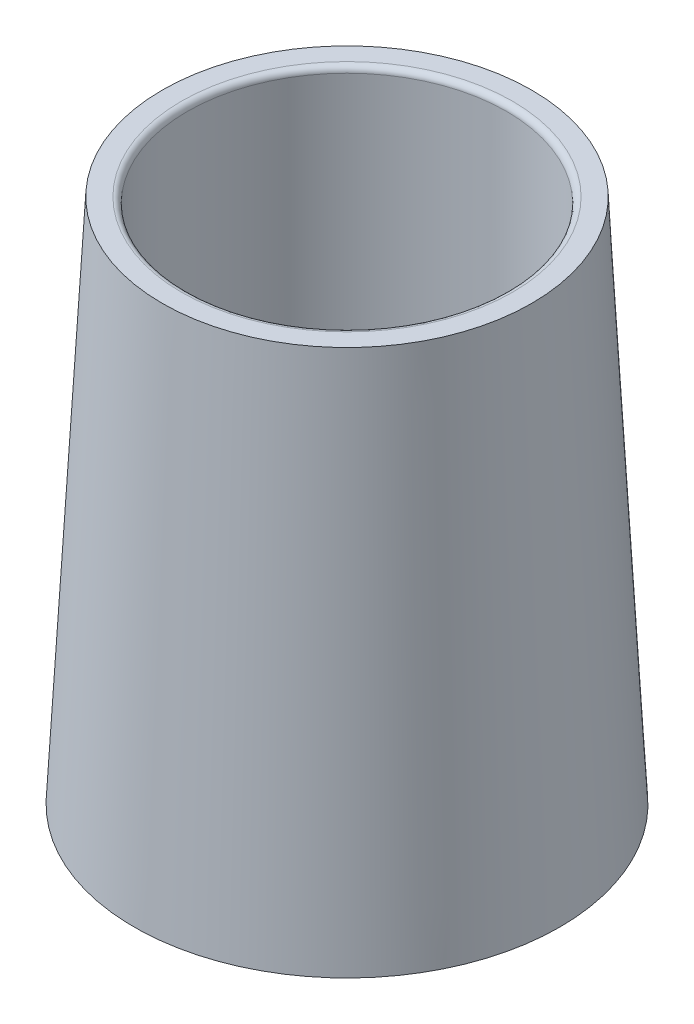
ISO-10303-21;
HEADER;
FILE_DESCRIPTION(('STEP AP214'),'2;1');
FILE_NAME('part.step','',(''),(''),'','','');
FILE_SCHEMA(('AUTOMOTIVE_DESIGN { 1 0 10303 214 1 1 1 1 }'));
ENDSEC;
DATA;
#1=APPLICATION_CONTEXT('core data for automotive mechanical design processes');
#2=APPLICATION_PROTOCOL_DEFINITION('international standard','automotive_design',2000,#1);
#3=PRODUCT_CONTEXT('',#1,'mechanical');
#4=PRODUCT('Part','Part','',(#3));
#5=PRODUCT_RELATED_PRODUCT_CATEGORY('part','',(#4));
#6=PRODUCT_DEFINITION_FORMATION('','',#4);
#7=PRODUCT_DEFINITION_CONTEXT('part definition',#1,'design');
#8=PRODUCT_DEFINITION('design','',#6,#7);
#9=PRODUCT_DEFINITION_SHAPE('','',#8);
#10=(LENGTH_UNIT() NAMED_UNIT(*) SI_UNIT(.MILLI.,.METRE.));
#11=(NAMED_UNIT(*) PLANE_ANGLE_UNIT() SI_UNIT($,.RADIAN.));
#12=(NAMED_UNIT(*) SI_UNIT($,.STERADIAN.) SOLID_ANGLE_UNIT());
#13=UNCERTAINTY_MEASURE_WITH_UNIT(LENGTH_MEASURE(1.E-05),#10,'distance_accuracy_value','');
#14=(GEOMETRIC_REPRESENTATION_CONTEXT(3) GLOBAL_UNCERTAINTY_ASSIGNED_CONTEXT((#13)) GLOBAL_UNIT_ASSIGNED_CONTEXT((#10,
#11,#12)) REPRESENTATION_CONTEXT('',''));
#15=CARTESIAN_POINT('',(0.,0.,0.));
#16=DIRECTION('',(0.,0.,1.));
#17=DIRECTION('',(1.,0.,0.));
#18=AXIS2_PLACEMENT_3D('',#15,#16,#17);
#19=CARTESIAN_POINT('',(0.,0.,0.));
#20=DIRECTION('',(0.,1.,0.));
#21=DIRECTION('',(-1.,0.,0.));
#22=AXIS2_PLACEMENT_3D('',#19,#20,#21);
#23=PLANE('',#22);
#24=CARTESIAN_POINT('',(0.,0.,0.));
#25=DIRECTION('',(0.,-1.,0.));
#26=DIRECTION('',(1.,0.,0.));
#27=AXIS2_PLACEMENT_3D('',#24,#25,#26);
#28=CIRCLE('',#27,28.9);
#29=CARTESIAN_POINT('',(28.9,0.,0.));
#30=VERTEX_POINT('',#29);
#31=EDGE_CURVE('E67',#30,#30,#28,.T.);
#32=ORIENTED_EDGE('',*,*,#31,.F.);
#33=EDGE_LOOP('',(#32));
#34=FACE_BOUND('',#33,.T.);
#35=CARTESIAN_POINT('',(0.,0.,0.));
#36=DIRECTION('',(0.,1.,0.));
#37=DIRECTION('',(-1.,0.,0.));
#38=AXIS2_PLACEMENT_3D('',#35,#36,#37);
#39=CIRCLE('',#38,36.);
#40=CARTESIAN_POINT('',(-36.,0.,0.));
#41=VERTEX_POINT('',#40);
#42=EDGE_CURVE('E57',#41,#41,#39,.T.);
#43=ORIENTED_EDGE('',*,*,#42,.F.);
#44=EDGE_LOOP('',(#43));
#45=FACE_BOUND('',#44,.T.);
#46=ADVANCED_FACE('F31',(#34,#45),#23,.F.);
#47=CARTESIAN_POINT('',(0.,0.,0.));
#48=DIRECTION('',(0.,-1.,0.));
#49=DIRECTION('',(1.,0.,0.));
#50=AXIS2_PLACEMENT_3D('',#47,#48,#49);
#51=CONICAL_SURFACE('',#50,36.,0.0533201984374761);
#52=CARTESIAN_POINT('',(0.,89.,0.));
#53=DIRECTION('',(0.,1.,0.));
#54=DIRECTION('',(-1.,0.,0.));
#55=AXIS2_PLACEMENT_3D('',#52,#53,#54);
#56=CIRCLE('',#55,31.25);
#57=CARTESIAN_POINT('',(-31.25,89.,0.));
#58=VERTEX_POINT('',#57);
#59=EDGE_CURVE('E60',#58,#58,#56,.T.);
#60=ORIENTED_EDGE('',*,*,#59,.F.);
#61=EDGE_LOOP('',(#60));
#62=FACE_BOUND('',#61,.T.);
#63=ORIENTED_EDGE('',*,*,#42,.T.);
#64=EDGE_LOOP('',(#63));
#65=FACE_BOUND('',#64,.T.);
#66=ADVANCED_FACE('F84',(#62,#65),#51,.T.);
#67=CARTESIAN_POINT('',(31.25,89.,0.));
#68=DIRECTION('',(0.,-1.,0.));
#69=DIRECTION('',(1.,0.,0.));
#70=AXIS2_PLACEMENT_3D('',#67,#68,#69);
#71=PLANE('',#70);
#72=CARTESIAN_POINT('',(0.,89.,0.));
#73=DIRECTION('',(0.,-1.,0.));
#74=DIRECTION('',(1.,0.,0.));
#75=AXIS2_PLACEMENT_3D('',#72,#73,#74);
#76=CIRCLE('',#75,28.);
#77=CARTESIAN_POINT('',(28.,89.,0.));
#78=VERTEX_POINT('',#77);
#79=EDGE_CURVE('E51',#78,#78,#76,.T.);
#80=ORIENTED_EDGE('',*,*,#79,.T.);
#81=EDGE_LOOP('',(#80));
#82=FACE_BOUND('',#81,.T.);
#83=ORIENTED_EDGE('',*,*,#59,.T.);
#84=EDGE_LOOP('',(#83));
#85=FACE_BOUND('',#84,.T.);
#86=ADVANCED_FACE('F89',(#82,#85),#71,.F.);
#87=CARTESIAN_POINT('',(0.,32.,0.));
#88=DIRECTION('',(0.,1.,0.));
#89=DIRECTION('',(-1.,0.,0.));
#90=AXIS2_PLACEMENT_3D('',#87,#88,#89);
#91=CYLINDRICAL_SURFACE('',#90,27.);
#92=CARTESIAN_POINT('',(0.,88.,0.));
#93=DIRECTION('',(0.,-1.,0.));
#94=DIRECTION('',(1.,0.,0.));
#95=AXIS2_PLACEMENT_3D('',#92,#93,#94);
#96=CIRCLE('',#95,27.);
#97=CARTESIAN_POINT('',(-27.,88.,0.));
#98=VERTEX_POINT('',#97);
#99=EDGE_CURVE('E54',#98,#98,#96,.F.);
#100=CARTESIAN_POINT('',(0.,32.,0.));
#101=DIRECTION('',(0.,1.,0.));
#102=DIRECTION('',(-1.,0.,0.));
#103=AXIS2_PLACEMENT_3D('',#100,#101,#102);
#104=CIRCLE('',#103,27.);
#105=CARTESIAN_POINT('',(-27.,32.,0.));
#106=VERTEX_POINT('',#105);
#107=EDGE_CURVE('E63',#106,#106,#104,.T.);
#108=CARTESIAN_POINT('',(-27.,88.,0.));
#109=CARTESIAN_POINT('',(-27.,87.4166666666667,0.));
#110=CARTESIAN_POINT('',(-27.,86.8333333333333,0.));
#111=CARTESIAN_POINT('',(-27.,85.6666666666667,0.));
#112=CARTESIAN_POINT('',(-27.,85.0833333333333,0.));
#113=CARTESIAN_POINT('',(-27.,83.9166666666667,0.));
#114=CARTESIAN_POINT('',(-27.,83.3333333333333,0.));
#115=CARTESIAN_POINT('',(-27.,82.1666666666667,0.));
#116=CARTESIAN_POINT('',(-27.,81.5833333333333,0.));
#117=CARTESIAN_POINT('',(-27.,80.4166666666667,0.));
#118=CARTESIAN_POINT('',(-27.,79.8333333333333,0.));
#119=CARTESIAN_POINT('',(-27.,78.6666666666667,0.));
#120=CARTESIAN_POINT('',(-27.,78.0833333333333,0.));
#121=CARTESIAN_POINT('',(-27.,76.9166666666667,0.));
#122=CARTESIAN_POINT('',(-27.,76.3333333333333,0.));
#123=CARTESIAN_POINT('',(-27.,75.1666666666667,0.));
#124=CARTESIAN_POINT('',(-27.,74.5833333333333,0.));
#125=CARTESIAN_POINT('',(-27.,73.4166666666667,0.));
#126=CARTESIAN_POINT('',(-27.,72.8333333333333,0.));
#127=CARTESIAN_POINT('',(-27.,71.6666666666667,0.));
#128=CARTESIAN_POINT('',(-27.,71.0833333333333,0.));
#129=CARTESIAN_POINT('',(-27.,69.9166666666667,0.));
#130=CARTESIAN_POINT('',(-27.,69.3333333333333,0.));
#131=CARTESIAN_POINT('',(-27.,68.1666666666667,0.));
#132=CARTESIAN_POINT('',(-27.,67.5833333333333,0.));
#133=CARTESIAN_POINT('',(-27.,66.4166666666667,0.));
#134=CARTESIAN_POINT('',(-27.,65.8333333333333,0.));
#135=CARTESIAN_POINT('',(-27.,64.6666666666667,0.));
#136=CARTESIAN_POINT('',(-27.,64.0833333333333,0.));
#137=CARTESIAN_POINT('',(-27.,62.9166666666667,0.));
#138=CARTESIAN_POINT('',(-27.,62.3333333333333,0.));
#139=CARTESIAN_POINT('',(-27.,61.1666666666667,0.));
#140=CARTESIAN_POINT('',(-27.,60.5833333333333,0.));
#141=CARTESIAN_POINT('',(-27.,59.4166666666667,0.));
#142=CARTESIAN_POINT('',(-27.,58.8333333333333,0.));
#143=CARTESIAN_POINT('',(-27.,57.6666666666667,0.));
#144=CARTESIAN_POINT('',(-27.,57.0833333333333,0.));
#145=CARTESIAN_POINT('',(-27.,55.9166666666667,0.));
#146=CARTESIAN_POINT('',(-27.,55.3333333333333,0.));
#147=CARTESIAN_POINT('',(-27.,54.1666666666667,0.));
#148=CARTESIAN_POINT('',(-27.,53.5833333333333,0.));
#149=CARTESIAN_POINT('',(-27.,52.4166666666667,0.));
#150=CARTESIAN_POINT('',(-27.,51.8333333333333,0.));
#151=CARTESIAN_POINT('',(-27.,50.6666666666667,0.));
#152=CARTESIAN_POINT('',(-27.,50.0833333333333,0.));
#153=CARTESIAN_POINT('',(-27.,48.9166666666667,0.));
#154=CARTESIAN_POINT('',(-27.,48.3333333333333,0.));
#155=CARTESIAN_POINT('',(-27.,47.1666666666667,0.));
#156=CARTESIAN_POINT('',(-27.,46.5833333333333,0.));
#157=CARTESIAN_POINT('',(-27.,45.4166666666667,0.));
#158=CARTESIAN_POINT('',(-27.,44.8333333333333,0.));
#159=CARTESIAN_POINT('',(-27.,43.6666666666667,0.));
#160=CARTESIAN_POINT('',(-27.,43.0833333333333,0.));
#161=CARTESIAN_POINT('',(-27.,41.9166666666667,0.));
#162=CARTESIAN_POINT('',(-27.,41.3333333333333,0.));
#163=CARTESIAN_POINT('',(-27.,40.1666666666667,0.));
#164=CARTESIAN_POINT('',(-27.,39.5833333333333,0.));
#165=CARTESIAN_POINT('',(-27.,38.4166666666667,0.));
#166=CARTESIAN_POINT('',(-27.,37.8333333333333,0.));
#167=CARTESIAN_POINT('',(-27.,36.6666666666667,0.));
#168=CARTESIAN_POINT('',(-27.,36.0833333333333,0.));
#169=CARTESIAN_POINT('',(-27.,34.9166666666667,0.));
#170=CARTESIAN_POINT('',(-27.,34.3333333333333,0.));
#171=CARTESIAN_POINT('',(-27.,33.1666666666667,0.));
#172=CARTESIAN_POINT('',(-27.,32.5833333333333,0.));
#173=CARTESIAN_POINT('',(-27.,32.,0.));
#174=B_SPLINE_CURVE_WITH_KNOTS('',3,(#108,#109,#110,#111,#112,#113,#114,#115,#116,#117,#118,
#119,#120,#121,#122,#123,#124,#125,#126,#127,#128,#129,#130,#131,#132,#133,#134,#135,#136,#137,
#138,#139,#140,#141,#142,#143,#144,#145,#146,#147,#148,#149,#150,#151,#152,#153,#154,#155,#156,
#157,#158,#159,#160,#161,#162,#163,#164,#165,#166,#167,#168,#169,#170,#171,#172,#173),
.UNSPECIFIED.,.F.,.F.,(4,2,2,2,2,2,2,2,2,2,2,2,2,2,2,2,2,2,2,2,2,2,2,2,2,2,2,2,2,2,2,2,4),(0.,
1.75,3.5,5.25,6.99999999999999,8.74999999999999,10.5,12.25,14.,15.75,17.5,19.25,21.,22.75,24.5,
26.25,28.,29.75,31.5,33.25,35.,36.75,38.5,40.25,42.,43.75,45.5,47.25,49.,50.75,52.5,54.25,56.),.UNSPECIFIED.);
#175=EDGE_CURVE('BSEAM95',#98,#106,#174,.T.);
#176=ORIENTED_EDGE('',*,*,#99,.T.);
#177=ORIENTED_EDGE('',*,*,#107,.F.);
#178=ORIENTED_EDGE('',*,*,#175,.T.);
#179=ORIENTED_EDGE('',*,*,#175,.F.);
#180=EDGE_LOOP('',(#176,#178,#177,#179));
#181=FACE_BOUND('',#180,.T.);
#182=ADVANCED_FACE('F95',(#181),#91,.F.);
#183=CARTESIAN_POINT('',(0.,32.,0.));
#184=DIRECTION('',(0.,1.,0.));
#185=DIRECTION('',(-1.,0.,0.));
#186=AXIS2_PLACEMENT_3D('',#183,#184,#185);
#187=PLANE('',#186);
#188=CARTESIAN_POINT('',(0.,32.,0.));
#189=DIRECTION('',(0.,1.,0.));
#190=DIRECTION('',(-1.,0.,0.));
#191=AXIS2_PLACEMENT_3D('',#188,#189,#190);
#192=CIRCLE('',#191,24.);
#193=CARTESIAN_POINT('',(-24.,32.,0.));
#194=VERTEX_POINT('',#193);
#195=EDGE_CURVE('E38',#194,#194,#192,.F.);
#196=ORIENTED_EDGE('',*,*,#195,.T.);
#197=EDGE_LOOP('',(#196));
#198=FACE_BOUND('',#197,.T.);
#199=ORIENTED_EDGE('',*,*,#107,.T.);
#200=EDGE_LOOP('',(#199));
#201=FACE_BOUND('',#200,.T.);
#202=ADVANCED_FACE('F78',(#198,#201),#187,.T.);
#203=CARTESIAN_POINT('',(0.,11.,0.));
#204=DIRECTION('',(0.,-1.,0.));
#205=DIRECTION('',(1.,0.,0.));
#206=AXIS2_PLACEMENT_3D('',#203,#204,#205);
#207=CYLINDRICAL_SURFACE('',#206,28.9);
#208=CARTESIAN_POINT('',(0.,11.,0.));
#209=DIRECTION('',(0.,-1.,0.));
#210=DIRECTION('',(1.,0.,0.));
#211=AXIS2_PLACEMENT_3D('',#208,#209,#210);
#212=CIRCLE('',#211,28.9);
#213=CARTESIAN_POINT('',(28.9,11.,0.));
#214=VERTEX_POINT('',#213);
#215=EDGE_CURVE('E66',#214,#214,#212,.T.);
#216=ORIENTED_EDGE('',*,*,#215,.F.);
#217=EDGE_LOOP('',(#216));
#218=FACE_BOUND('',#217,.T.);
#219=ORIENTED_EDGE('',*,*,#31,.T.);
#220=EDGE_LOOP('',(#219));
#221=FACE_BOUND('',#220,.T.);
#222=ADVANCED_FACE('F75',(#218,#221),#207,.F.);
#223=CARTESIAN_POINT('',(0.,11.,0.));
#224=DIRECTION('',(0.,-1.,0.));
#225=DIRECTION('',(1.,0.,0.));
#226=AXIS2_PLACEMENT_3D('',#223,#224,#225);
#227=PLANE('',#226);
#228=CARTESIAN_POINT('',(0.,11.,0.));
#229=DIRECTION('',(0.,-1.,0.));
#230=DIRECTION('',(1.,0.,0.));
#231=AXIS2_PLACEMENT_3D('',#228,#229,#230);
#232=CIRCLE('',#231,24.);
#233=CARTESIAN_POINT('',(24.,11.,0.));
#234=VERTEX_POINT('',#233);
#235=EDGE_CURVE('E10',#234,#234,#232,.F.);
#236=ORIENTED_EDGE('',*,*,#235,.T.);
#237=EDGE_LOOP('',(#236));
#238=FACE_BOUND('',#237,.T.);
#239=ORIENTED_EDGE('',*,*,#215,.T.);
#240=EDGE_LOOP('',(#239));
#241=FACE_BOUND('',#240,.T.);
#242=ADVANCED_FACE('F73',(#238,#241),#227,.T.);
#243=CARTESIAN_POINT('',(0.,89.,0.));
#244=DIRECTION('',(0.,-1.,0.));
#245=DIRECTION('',(1.,0.,0.));
#246=AXIS2_PLACEMENT_3D('',#243,#244,#245);
#247=CYLINDRICAL_SURFACE('',#246,23.);
#248=CARTESIAN_POINT('',(0.,31.,0.));
#249=DIRECTION('',(0.,1.,0.));
#250=DIRECTION('',(-1.,0.,0.));
#251=AXIS2_PLACEMENT_3D('',#248,#249,#250);
#252=CIRCLE('',#251,23.);
#253=CARTESIAN_POINT('',(-23.,31.,0.));
#254=VERTEX_POINT('',#253);
#255=EDGE_CURVE('E42',#254,#254,#252,.T.);
#256=ORIENTED_EDGE('',*,*,#255,.T.);
#257=EDGE_LOOP('',(#256));
#258=FACE_BOUND('',#257,.T.);
#259=CARTESIAN_POINT('',(0.,12.,0.));
#260=DIRECTION('',(0.,-1.,0.));
#261=DIRECTION('',(1.,0.,0.));
#262=AXIS2_PLACEMENT_3D('',#259,#260,#261);
#263=CIRCLE('',#262,23.);
#264=CARTESIAN_POINT('',(23.,12.,0.));
#265=VERTEX_POINT('',#264);
#266=EDGE_CURVE('E46',#265,#265,#263,.T.);
#267=ORIENTED_EDGE('',*,*,#266,.T.);
#268=EDGE_LOOP('',(#267));
#269=FACE_BOUND('',#268,.T.);
#270=ADVANCED_FACE('F104',(#258,#269),#247,.F.);
#271=CARTESIAN_POINT('',(0.,88.,0.));
#272=DIRECTION('',(0.,-1.,0.));
#273=DIRECTION('',(1.,0.,0.));
#274=AXIS2_PLACEMENT_3D('',#271,#272,#273);
#275=TOROIDAL_SURFACE('',#274,28.,1.);
#276=ORIENTED_EDGE('',*,*,#79,.F.);
#277=EDGE_LOOP('',(#276));
#278=FACE_BOUND('',#277,.T.);
#279=ORIENTED_EDGE('',*,*,#99,.F.);
#280=EDGE_LOOP('',(#279));
#281=FACE_BOUND('',#280,.T.);
#282=ADVANCED_FACE('F101',(#278,#281),#275,.T.);
#283=CARTESIAN_POINT('',(0.,31.,0.));
#284=DIRECTION('',(0.,1.,0.));
#285=DIRECTION('',(-1.,0.,0.));
#286=AXIS2_PLACEMENT_3D('',#283,#284,#285);
#287=TOROIDAL_SURFACE('',#286,24.,1.);
#288=ORIENTED_EDGE('',*,*,#195,.F.);
#289=EDGE_LOOP('',(#288));
#290=FACE_BOUND('',#289,.T.);
#291=ORIENTED_EDGE('',*,*,#255,.F.);
#292=EDGE_LOOP('',(#291));
#293=FACE_BOUND('',#292,.T.);
#294=ADVANCED_FACE('F103',(#290,#293),#287,.T.);
#295=CARTESIAN_POINT('',(0.,12.,0.));
#296=DIRECTION('',(0.,-1.,0.));
#297=DIRECTION('',(1.,0.,0.));
#298=AXIS2_PLACEMENT_3D('',#295,#296,#297);
#299=TOROIDAL_SURFACE('',#298,24.,1.);
#300=ORIENTED_EDGE('',*,*,#235,.F.);
#301=EDGE_LOOP('',(#300));
#302=FACE_BOUND('',#301,.T.);
#303=ORIENTED_EDGE('',*,*,#266,.F.);
#304=EDGE_LOOP('',(#303));
#305=FACE_BOUND('',#304,.T.);
#306=ADVANCED_FACE('F33',(#302,#305),#299,.T.);
#307=CLOSED_SHELL('',(#46,#66,#86,#182,#202,#222,#242,#270,#282,#294,#306));
#308=MANIFOLD_SOLID_BREP('B2',#307);
#309=ADVANCED_BREP_SHAPE_REPRESENTATION('',(#18,#308),#14);
#310=SHAPE_DEFINITION_REPRESENTATION(#9,#309);
ENDSEC;
END-ISO-10303-21;
